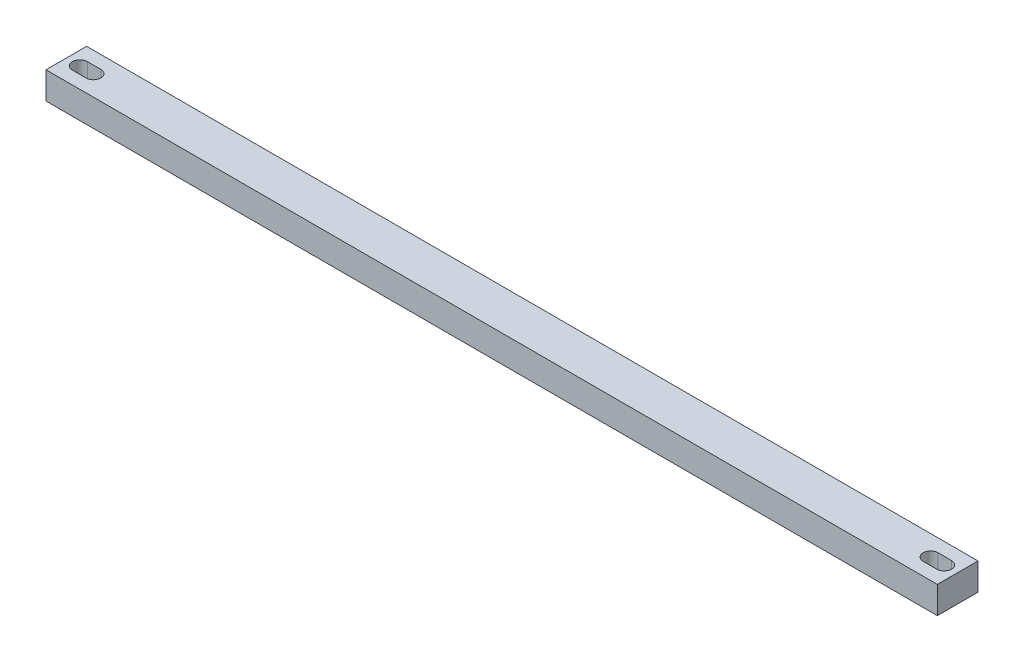
ISO-10303-21;
HEADER;
FILE_DESCRIPTION(('STEP AP214'),'2;1');
FILE_NAME('part.step','',(''),(''),'','','');
FILE_SCHEMA(('AUTOMOTIVE_DESIGN { 1 0 10303 214 1 1 1 1 }'));
ENDSEC;
DATA;
#1=APPLICATION_CONTEXT('core data for automotive mechanical design processes');
#2=APPLICATION_PROTOCOL_DEFINITION('international standard','automotive_design',2000,#1);
#3=PRODUCT_CONTEXT('',#1,'mechanical');
#4=PRODUCT('Part','Part','',(#3));
#5=PRODUCT_RELATED_PRODUCT_CATEGORY('part','',(#4));
#6=PRODUCT_DEFINITION_FORMATION('','',#4);
#7=PRODUCT_DEFINITION_CONTEXT('part definition',#1,'design');
#8=PRODUCT_DEFINITION('design','',#6,#7);
#9=PRODUCT_DEFINITION_SHAPE('','',#8);
#10=(LENGTH_UNIT() NAMED_UNIT(*) SI_UNIT(.MILLI.,.METRE.));
#11=(NAMED_UNIT(*) PLANE_ANGLE_UNIT() SI_UNIT($,.RADIAN.));
#12=(NAMED_UNIT(*) SI_UNIT($,.STERADIAN.) SOLID_ANGLE_UNIT());
#13=UNCERTAINTY_MEASURE_WITH_UNIT(LENGTH_MEASURE(1.E-05),#10,'distance_accuracy_value','');
#14=(GEOMETRIC_REPRESENTATION_CONTEXT(3) GLOBAL_UNCERTAINTY_ASSIGNED_CONTEXT((#13)) GLOBAL_UNIT_ASSIGNED_CONTEXT((#10,
#11,#12)) REPRESENTATION_CONTEXT('',''));
#15=CARTESIAN_POINT('',(0.,0.,0.));
#16=DIRECTION('',(0.,0.,1.));
#17=DIRECTION('',(1.,0.,0.));
#18=AXIS2_PLACEMENT_3D('',#15,#16,#17);
#19=CARTESIAN_POINT('',(0.,20.,0.));
#20=DIRECTION('',(0.,-1.,0.));
#21=DIRECTION('',(0.,0.,-1.));
#22=AXIS2_PLACEMENT_3D('',#19,#20,#21);
#23=PLANE('',#22);
#24=DIRECTION('',(0.,0.,-1.));
#25=VECTOR('',#24,1.);
#26=CARTESIAN_POINT('',(329.,20.,15.));
#27=LINE('',#26,#25);
#28=CARTESIAN_POINT('',(329.,20.,15.));
#29=VERTEX_POINT('',#28);
#30=CARTESIAN_POINT('',(329.,20.,-15.));
#31=VERTEX_POINT('',#30);
#32=EDGE_CURVE('E172',#29,#31,#27,.T.);
#33=ORIENTED_EDGE('',*,*,#32,.T.);
#34=DIRECTION('',(-1.,0.,0.));
#35=VECTOR('',#34,1.);
#36=CARTESIAN_POINT('',(-329.,20.,-15.));
#37=LINE('',#36,#35);
#38=CARTESIAN_POINT('',(-329.,20.,-15.));
#39=VERTEX_POINT('',#38);
#40=EDGE_CURVE('E175',#31,#39,#37,.T.);
#41=ORIENTED_EDGE('',*,*,#40,.T.);
#42=DIRECTION('',(0.,0.,1.));
#43=VECTOR('',#42,1.);
#44=CARTESIAN_POINT('',(-329.,20.,15.));
#45=LINE('',#44,#43);
#46=CARTESIAN_POINT('',(-329.,20.,15.));
#47=VERTEX_POINT('',#46);
#48=EDGE_CURVE('E178',#39,#47,#45,.T.);
#49=ORIENTED_EDGE('',*,*,#48,.T.);
#50=DIRECTION('',(1.,0.,0.));
#51=VECTOR('',#50,1.);
#52=CARTESIAN_POINT('',(-329.,20.,15.));
#53=LINE('',#52,#51);
#54=EDGE_CURVE('E180',#47,#29,#53,.T.);
#55=ORIENTED_EDGE('',*,*,#54,.T.);
#56=EDGE_LOOP('',(#33,#41,#49,#55));
#57=FACE_BOUND('',#56,.T.);
#58=DIRECTION('',(-1.,0.,0.));
#59=VECTOR('',#58,1.);
#60=CARTESIAN_POINT('',(-319.,20.,5.5));
#61=LINE('',#60,#59);
#62=CARTESIAN_POINT('',(-309.,20.,5.5));
#63=VERTEX_POINT('',#62);
#64=CARTESIAN_POINT('',(-319.,20.,5.5));
#65=VERTEX_POINT('',#64);
#66=EDGE_CURVE('E150',#63,#65,#61,.T.);
#67=ORIENTED_EDGE('',*,*,#66,.T.);
#68=CARTESIAN_POINT('',(-319.,20.,0.));
#69=DIRECTION('',(0.,-1.,0.));
#70=DIRECTION('',(0.,0.,-1.));
#71=AXIS2_PLACEMENT_3D('',#68,#69,#70);
#72=CIRCLE('',#71,5.5);
#73=CARTESIAN_POINT('',(-319.,20.,-5.5));
#74=VERTEX_POINT('',#73);
#75=EDGE_CURVE('E140',#65,#74,#72,.T.);
#76=ORIENTED_EDGE('',*,*,#75,.T.);
#77=DIRECTION('',(1.,0.,0.));
#78=VECTOR('',#77,1.);
#79=CARTESIAN_POINT('',(-319.,20.,-5.5));
#80=LINE('',#79,#78);
#81=CARTESIAN_POINT('',(-309.,20.,-5.5));
#82=VERTEX_POINT('',#81);
#83=EDGE_CURVE('E143',#74,#82,#80,.T.);
#84=ORIENTED_EDGE('',*,*,#83,.T.);
#85=CARTESIAN_POINT('',(-309.,20.,0.));
#86=DIRECTION('',(0.,-1.,0.));
#87=DIRECTION('',(0.,0.,-1.));
#88=AXIS2_PLACEMENT_3D('',#85,#86,#87);
#89=CIRCLE('',#88,5.5);
#90=EDGE_CURVE('E147',#82,#63,#89,.T.);
#91=ORIENTED_EDGE('',*,*,#90,.T.);
#92=EDGE_LOOP('',(#67,#76,#84,#91));
#93=FACE_BOUND('',#92,.T.);
#94=CARTESIAN_POINT('',(319.,20.,0.));
#95=DIRECTION('',(0.,1.,0.));
#96=DIRECTION('',(0.,0.,-1.));
#97=AXIS2_PLACEMENT_3D('',#94,#95,#96);
#98=CIRCLE('',#97,5.5);
#99=CARTESIAN_POINT('',(319.,20.,5.5));
#100=VERTEX_POINT('',#99);
#101=CARTESIAN_POINT('',(319.,20.,-5.5));
#102=VERTEX_POINT('',#101);
#103=EDGE_CURVE('E114',#100,#102,#98,.T.);
#104=ORIENTED_EDGE('',*,*,#103,.F.);
#105=DIRECTION('',(1.,0.,0.));
#106=VECTOR('',#105,1.);
#107=CARTESIAN_POINT('',(319.,20.,5.5));
#108=LINE('',#107,#106);
#109=CARTESIAN_POINT('',(309.,20.,5.5));
#110=VERTEX_POINT('',#109);
#111=EDGE_CURVE('E106',#110,#100,#108,.T.);
#112=ORIENTED_EDGE('',*,*,#111,.F.);
#113=CARTESIAN_POINT('',(309.,20.,0.));
#114=DIRECTION('',(0.,1.,0.));
#115=DIRECTION('',(0.,0.,-1.));
#116=AXIS2_PLACEMENT_3D('',#113,#114,#115);
#117=CIRCLE('',#116,5.5);
#118=CARTESIAN_POINT('',(309.,20.,-5.5));
#119=VERTEX_POINT('',#118);
#120=EDGE_CURVE('E113',#119,#110,#117,.T.);
#121=ORIENTED_EDGE('',*,*,#120,.F.);
#122=DIRECTION('',(-1.,0.,0.));
#123=VECTOR('',#122,1.);
#124=CARTESIAN_POINT('',(319.,20.,-5.5));
#125=LINE('',#124,#123);
#126=EDGE_CURVE('E118',#102,#119,#125,.T.);
#127=ORIENTED_EDGE('',*,*,#126,.F.);
#128=EDGE_LOOP('',(#104,#112,#121,#127));
#129=FACE_BOUND('',#128,.T.);
#130=ADVANCED_FACE('F17',(#57,#93,#129),#23,.F.);
#131=CARTESIAN_POINT('',(0.,0.,0.));
#132=DIRECTION('',(0.,-1.,0.));
#133=DIRECTION('',(0.,0.,-1.));
#134=AXIS2_PLACEMENT_3D('',#131,#132,#133);
#135=PLANE('',#134);
#136=DIRECTION('',(0.,0.,-1.));
#137=VECTOR('',#136,1.);
#138=CARTESIAN_POINT('',(329.,0.,15.));
#139=LINE('',#138,#137);
#140=CARTESIAN_POINT('',(329.,0.,15.));
#141=VERTEX_POINT('',#140);
#142=CARTESIAN_POINT('',(329.,0.,-15.));
#143=VERTEX_POINT('',#142);
#144=EDGE_CURVE('E165',#141,#143,#139,.T.);
#145=ORIENTED_EDGE('',*,*,#144,.F.);
#146=DIRECTION('',(1.,0.,0.));
#147=VECTOR('',#146,1.);
#148=CARTESIAN_POINT('',(-329.,0.,15.));
#149=LINE('',#148,#147);
#150=CARTESIAN_POINT('',(-329.,0.,15.));
#151=VERTEX_POINT('',#150);
#152=EDGE_CURVE('E176',#151,#141,#149,.T.);
#153=ORIENTED_EDGE('',*,*,#152,.F.);
#154=DIRECTION('',(0.,0.,1.));
#155=VECTOR('',#154,1.);
#156=CARTESIAN_POINT('',(-329.,0.,15.));
#157=LINE('',#156,#155);
#158=CARTESIAN_POINT('',(-329.,0.,-15.));
#159=VERTEX_POINT('',#158);
#160=EDGE_CURVE('E187',#159,#151,#157,.T.);
#161=ORIENTED_EDGE('',*,*,#160,.F.);
#162=DIRECTION('',(-1.,0.,0.));
#163=VECTOR('',#162,1.);
#164=CARTESIAN_POINT('',(-329.,0.,-15.));
#165=LINE('',#164,#163);
#166=EDGE_CURVE('E185',#143,#159,#165,.T.);
#167=ORIENTED_EDGE('',*,*,#166,.F.);
#168=EDGE_LOOP('',(#145,#153,#161,#167));
#169=FACE_BOUND('',#168,.T.);
#170=CARTESIAN_POINT('',(-319.,0.,0.));
#171=DIRECTION('',(0.,-1.,0.));
#172=DIRECTION('',(0.,0.,-1.));
#173=AXIS2_PLACEMENT_3D('',#170,#171,#172);
#174=CIRCLE('',#173,5.5);
#175=CARTESIAN_POINT('',(-319.,0.,5.5));
#176=VERTEX_POINT('',#175);
#177=CARTESIAN_POINT('',(-319.,0.,-5.5));
#178=VERTEX_POINT('',#177);
#179=EDGE_CURVE('E136',#176,#178,#174,.T.);
#180=ORIENTED_EDGE('',*,*,#179,.F.);
#181=DIRECTION('',(-1.,0.,0.));
#182=VECTOR('',#181,1.);
#183=CARTESIAN_POINT('',(-319.,0.,5.5));
#184=LINE('',#183,#182);
#185=CARTESIAN_POINT('',(-309.,0.,5.5));
#186=VERTEX_POINT('',#185);
#187=EDGE_CURVE('E144',#186,#176,#184,.T.);
#188=ORIENTED_EDGE('',*,*,#187,.F.);
#189=CARTESIAN_POINT('',(-309.,0.,0.));
#190=DIRECTION('',(0.,-1.,0.));
#191=DIRECTION('',(0.,0.,-1.));
#192=AXIS2_PLACEMENT_3D('',#189,#190,#191);
#193=CIRCLE('',#192,5.5);
#194=CARTESIAN_POINT('',(-309.,0.,-5.5));
#195=VERTEX_POINT('',#194);
#196=EDGE_CURVE('E158',#195,#186,#193,.T.);
#197=ORIENTED_EDGE('',*,*,#196,.F.);
#198=DIRECTION('',(1.,0.,0.));
#199=VECTOR('',#198,1.);
#200=CARTESIAN_POINT('',(-319.,0.,-5.5));
#201=LINE('',#200,#199);
#202=EDGE_CURVE('E155',#178,#195,#201,.T.);
#203=ORIENTED_EDGE('',*,*,#202,.F.);
#204=EDGE_LOOP('',(#180,#188,#197,#203));
#205=FACE_BOUND('',#204,.T.);
#206=DIRECTION('',(1.,0.,0.));
#207=VECTOR('',#206,1.);
#208=CARTESIAN_POINT('',(319.,0.,5.5));
#209=LINE('',#208,#207);
#210=CARTESIAN_POINT('',(309.,0.,5.5));
#211=VERTEX_POINT('',#210);
#212=CARTESIAN_POINT('',(319.,0.,5.5));
#213=VERTEX_POINT('',#212);
#214=EDGE_CURVE('E130',#211,#213,#209,.T.);
#215=ORIENTED_EDGE('',*,*,#214,.T.);
#216=CARTESIAN_POINT('',(319.,0.,0.));
#217=DIRECTION('',(0.,1.,0.));
#218=DIRECTION('',(0.,0.,-1.));
#219=AXIS2_PLACEMENT_3D('',#216,#217,#218);
#220=CIRCLE('',#219,5.5);
#221=CARTESIAN_POINT('',(319.,0.,-5.5));
#222=VERTEX_POINT('',#221);
#223=EDGE_CURVE('E40',#213,#222,#220,.T.);
#224=ORIENTED_EDGE('',*,*,#223,.T.);
#225=DIRECTION('',(-1.,0.,0.));
#226=VECTOR('',#225,1.);
#227=CARTESIAN_POINT('',(319.,0.,-5.5));
#228=LINE('',#227,#226);
#229=CARTESIAN_POINT('',(309.,0.,-5.5));
#230=VERTEX_POINT('',#229);
#231=EDGE_CURVE('E121',#222,#230,#228,.T.);
#232=ORIENTED_EDGE('',*,*,#231,.T.);
#233=CARTESIAN_POINT('',(309.,0.,0.));
#234=DIRECTION('',(0.,1.,0.));
#235=DIRECTION('',(0.,0.,-1.));
#236=AXIS2_PLACEMENT_3D('',#233,#234,#235);
#237=CIRCLE('',#236,5.5);
#238=EDGE_CURVE('E124',#230,#211,#237,.T.);
#239=ORIENTED_EDGE('',*,*,#238,.T.);
#240=EDGE_LOOP('',(#215,#224,#232,#239));
#241=FACE_BOUND('',#240,.T.);
#242=ADVANCED_FACE('F205',(#169,#205,#241),#135,.T.);
#243=CARTESIAN_POINT('',(329.,20.,15.));
#244=DIRECTION('',(-1.,0.,0.));
#245=DIRECTION('',(0.,0.,1.));
#246=AXIS2_PLACEMENT_3D('',#243,#244,#245);
#247=PLANE('',#246);
#248=ORIENTED_EDGE('',*,*,#144,.T.);
#249=DIRECTION('',(0.,-1.,0.));
#250=VECTOR('',#249,1.);
#251=CARTESIAN_POINT('',(329.,20.,-15.));
#252=LINE('',#251,#250);
#253=EDGE_CURVE('E11',#31,#143,#252,.T.);
#254=ORIENTED_EDGE('',*,*,#253,.F.);
#255=ORIENTED_EDGE('',*,*,#32,.F.);
#256=DIRECTION('',(0.,-1.,0.));
#257=VECTOR('',#256,1.);
#258=CARTESIAN_POINT('',(329.,20.,15.));
#259=LINE('',#258,#257);
#260=EDGE_CURVE('E182',#29,#141,#259,.T.);
#261=ORIENTED_EDGE('',*,*,#260,.T.);
#262=EDGE_LOOP('',(#248,#254,#255,#261));
#263=FACE_BOUND('',#262,.T.);
#264=ADVANCED_FACE('F19',(#263),#247,.F.);
#265=CARTESIAN_POINT('',(-329.,20.,-15.));
#266=DIRECTION('',(0.,0.,1.));
#267=DIRECTION('',(1.,0.,0.));
#268=AXIS2_PLACEMENT_3D('',#265,#266,#267);
#269=PLANE('',#268);
#270=ORIENTED_EDGE('',*,*,#166,.T.);
#271=DIRECTION('',(0.,-1.,0.));
#272=VECTOR('',#271,1.);
#273=CARTESIAN_POINT('',(-329.,20.,-15.));
#274=LINE('',#273,#272);
#275=EDGE_CURVE('E25',#39,#159,#274,.T.);
#276=ORIENTED_EDGE('',*,*,#275,.F.);
#277=ORIENTED_EDGE('',*,*,#40,.F.);
#278=ORIENTED_EDGE('',*,*,#253,.T.);
#279=EDGE_LOOP('',(#270,#276,#277,#278));
#280=FACE_BOUND('',#279,.T.);
#281=ADVANCED_FACE('F216',(#280),#269,.F.);
#282=CARTESIAN_POINT('',(-329.,20.,15.));
#283=DIRECTION('',(1.,0.,0.));
#284=DIRECTION('',(0.,0.,-1.));
#285=AXIS2_PLACEMENT_3D('',#282,#283,#284);
#286=PLANE('',#285);
#287=ORIENTED_EDGE('',*,*,#160,.T.);
#288=DIRECTION('',(0.,-1.,0.));
#289=VECTOR('',#288,1.);
#290=CARTESIAN_POINT('',(-329.,20.,15.));
#291=LINE('',#290,#289);
#292=EDGE_CURVE('E192',#47,#151,#291,.T.);
#293=ORIENTED_EDGE('',*,*,#292,.F.);
#294=ORIENTED_EDGE('',*,*,#48,.F.);
#295=ORIENTED_EDGE('',*,*,#275,.T.);
#296=EDGE_LOOP('',(#287,#293,#294,#295));
#297=FACE_BOUND('',#296,.T.);
#298=ADVANCED_FACE('F199',(#297),#286,.F.);
#299=CARTESIAN_POINT('',(-329.,20.,15.));
#300=DIRECTION('',(0.,0.,-1.));
#301=DIRECTION('',(-1.,0.,0.));
#302=AXIS2_PLACEMENT_3D('',#299,#300,#301);
#303=PLANE('',#302);
#304=ORIENTED_EDGE('',*,*,#152,.T.);
#305=ORIENTED_EDGE('',*,*,#260,.F.);
#306=ORIENTED_EDGE('',*,*,#54,.F.);
#307=ORIENTED_EDGE('',*,*,#292,.T.);
#308=EDGE_LOOP('',(#304,#305,#306,#307));
#309=FACE_BOUND('',#308,.T.);
#310=ADVANCED_FACE('F209',(#309),#303,.F.);
#311=CARTESIAN_POINT('',(-319.,20.,0.));
#312=DIRECTION('',(0.,-1.,0.));
#313=DIRECTION('',(0.,0.,-1.));
#314=AXIS2_PLACEMENT_3D('',#311,#312,#313);
#315=CYLINDRICAL_SURFACE('',#314,5.5);
#316=ORIENTED_EDGE('',*,*,#179,.T.);
#317=DIRECTION('',(0.,-1.,0.));
#318=VECTOR('',#317,1.);
#319=CARTESIAN_POINT('',(-319.,20.,-5.5));
#320=LINE('',#319,#318);
#321=EDGE_CURVE('E153',#74,#178,#320,.T.);
#322=ORIENTED_EDGE('',*,*,#321,.F.);
#323=ORIENTED_EDGE('',*,*,#75,.F.);
#324=DIRECTION('',(0.,-1.,0.));
#325=VECTOR('',#324,1.);
#326=CARTESIAN_POINT('',(-319.,20.,5.5));
#327=LINE('',#326,#325);
#328=EDGE_CURVE('E163',#65,#176,#327,.T.);
#329=ORIENTED_EDGE('',*,*,#328,.T.);
#330=EDGE_LOOP('',(#316,#322,#323,#329));
#331=FACE_BOUND('',#330,.T.);
#332=ADVANCED_FACE('F233',(#331),#315,.F.);
#333=CARTESIAN_POINT('',(-319.,20.,5.5));
#334=DIRECTION('',(0.,0.,1.));
#335=DIRECTION('',(1.,0.,0.));
#336=AXIS2_PLACEMENT_3D('',#333,#334,#335);
#337=PLANE('',#336);
#338=ORIENTED_EDGE('',*,*,#187,.T.);
#339=ORIENTED_EDGE('',*,*,#328,.F.);
#340=ORIENTED_EDGE('',*,*,#66,.F.);
#341=DIRECTION('',(0.,-1.,0.));
#342=VECTOR('',#341,1.);
#343=CARTESIAN_POINT('',(-309.,20.,5.5));
#344=LINE('',#343,#342);
#345=EDGE_CURVE('E166',#63,#186,#344,.T.);
#346=ORIENTED_EDGE('',*,*,#345,.T.);
#347=EDGE_LOOP('',(#338,#339,#340,#346));
#348=FACE_BOUND('',#347,.T.);
#349=ADVANCED_FACE('F241',(#348),#337,.F.);
#350=CARTESIAN_POINT('',(-309.,20.,0.));
#351=DIRECTION('',(0.,-1.,0.));
#352=DIRECTION('',(0.,0.,-1.));
#353=AXIS2_PLACEMENT_3D('',#350,#351,#352);
#354=CYLINDRICAL_SURFACE('',#353,5.5);
#355=ORIENTED_EDGE('',*,*,#196,.T.);
#356=ORIENTED_EDGE('',*,*,#345,.F.);
#357=ORIENTED_EDGE('',*,*,#90,.F.);
#358=DIRECTION('',(0.,-1.,0.));
#359=VECTOR('',#358,1.);
#360=CARTESIAN_POINT('',(-309.,20.,-5.5));
#361=LINE('',#360,#359);
#362=EDGE_CURVE('E168',#82,#195,#361,.T.);
#363=ORIENTED_EDGE('',*,*,#362,.T.);
#364=EDGE_LOOP('',(#355,#356,#357,#363));
#365=FACE_BOUND('',#364,.T.);
#366=ADVANCED_FACE('F247',(#365),#354,.F.);
#367=CARTESIAN_POINT('',(-319.,20.,-5.5));
#368=DIRECTION('',(0.,0.,-1.));
#369=DIRECTION('',(-1.,0.,0.));
#370=AXIS2_PLACEMENT_3D('',#367,#368,#369);
#371=PLANE('',#370);
#372=ORIENTED_EDGE('',*,*,#202,.T.);
#373=ORIENTED_EDGE('',*,*,#362,.F.);
#374=ORIENTED_EDGE('',*,*,#83,.F.);
#375=ORIENTED_EDGE('',*,*,#321,.T.);
#376=EDGE_LOOP('',(#372,#373,#374,#375));
#377=FACE_BOUND('',#376,.T.);
#378=ADVANCED_FACE('F256',(#377),#371,.F.);
#379=CARTESIAN_POINT('',(319.,20.,0.));
#380=DIRECTION('',(0.,-1.,0.));
#381=DIRECTION('',(0.,0.,-1.));
#382=AXIS2_PLACEMENT_3D('',#379,#380,#381);
#383=CYLINDRICAL_SURFACE('',#382,5.5);
#384=ORIENTED_EDGE('',*,*,#223,.F.);
#385=DIRECTION('',(0.,-1.,0.));
#386=VECTOR('',#385,1.);
#387=CARTESIAN_POINT('',(319.,20.,5.5));
#388=LINE('',#387,#386);
#389=EDGE_CURVE('E108',#100,#213,#388,.T.);
#390=ORIENTED_EDGE('',*,*,#389,.F.);
#391=ORIENTED_EDGE('',*,*,#103,.T.);
#392=DIRECTION('',(0.,-1.,0.));
#393=VECTOR('',#392,1.);
#394=CARTESIAN_POINT('',(319.,20.,-5.5));
#395=LINE('',#394,#393);
#396=EDGE_CURVE('E134',#102,#222,#395,.T.);
#397=ORIENTED_EDGE('',*,*,#396,.T.);
#398=EDGE_LOOP('',(#384,#390,#391,#397));
#399=FACE_BOUND('',#398,.T.);
#400=ADVANCED_FACE('F116',(#399),#383,.F.);
#401=CARTESIAN_POINT('',(319.,20.,-5.5));
#402=DIRECTION('',(0.,0.,1.));
#403=DIRECTION('',(1.,0.,0.));
#404=AXIS2_PLACEMENT_3D('',#401,#402,#403);
#405=PLANE('',#404);
#406=ORIENTED_EDGE('',*,*,#231,.F.);
#407=ORIENTED_EDGE('',*,*,#396,.F.);
#408=ORIENTED_EDGE('',*,*,#126,.T.);
#409=DIRECTION('',(0.,-1.,0.));
#410=VECTOR('',#409,1.);
#411=CARTESIAN_POINT('',(309.,20.,-5.5));
#412=LINE('',#411,#410);
#413=EDGE_CURVE('E137',#119,#230,#412,.T.);
#414=ORIENTED_EDGE('',*,*,#413,.T.);
#415=EDGE_LOOP('',(#406,#407,#408,#414));
#416=FACE_BOUND('',#415,.T.);
#417=ADVANCED_FACE('F271',(#416),#405,.T.);
#418=CARTESIAN_POINT('',(309.,20.,0.));
#419=DIRECTION('',(0.,-1.,0.));
#420=DIRECTION('',(0.,0.,-1.));
#421=AXIS2_PLACEMENT_3D('',#418,#419,#420);
#422=CYLINDRICAL_SURFACE('',#421,5.5);
#423=ORIENTED_EDGE('',*,*,#238,.F.);
#424=ORIENTED_EDGE('',*,*,#413,.F.);
#425=ORIENTED_EDGE('',*,*,#120,.T.);
#426=DIRECTION('',(0.,-1.,0.));
#427=VECTOR('',#426,1.);
#428=CARTESIAN_POINT('',(309.,20.,5.5));
#429=LINE('',#428,#427);
#430=EDGE_CURVE('E32',#110,#211,#429,.T.);
#431=ORIENTED_EDGE('',*,*,#430,.T.);
#432=EDGE_LOOP('',(#423,#424,#425,#431));
#433=FACE_BOUND('',#432,.T.);
#434=ADVANCED_FACE('F274',(#433),#422,.F.);
#435=CARTESIAN_POINT('',(319.,20.,5.5));
#436=DIRECTION('',(0.,0.,-1.));
#437=DIRECTION('',(-1.,0.,0.));
#438=AXIS2_PLACEMENT_3D('',#435,#436,#437);
#439=PLANE('',#438);
#440=ORIENTED_EDGE('',*,*,#214,.F.);
#441=ORIENTED_EDGE('',*,*,#430,.F.);
#442=ORIENTED_EDGE('',*,*,#111,.T.);
#443=ORIENTED_EDGE('',*,*,#389,.T.);
#444=EDGE_LOOP('',(#440,#441,#442,#443));
#445=FACE_BOUND('',#444,.T.);
#446=ADVANCED_FACE('F107',(#445),#439,.T.);
#447=CLOSED_SHELL('',(#130,#242,#264,#281,#298,#310,#332,#349,#366,#378,#400,#417,#434,#446));
#448=MANIFOLD_SOLID_BREP('B1',#447);
#449=ADVANCED_BREP_SHAPE_REPRESENTATION('',(#18,#448),#14);
#450=SHAPE_DEFINITION_REPRESENTATION(#9,#449);
ENDSEC;
END-ISO-10303-21;
